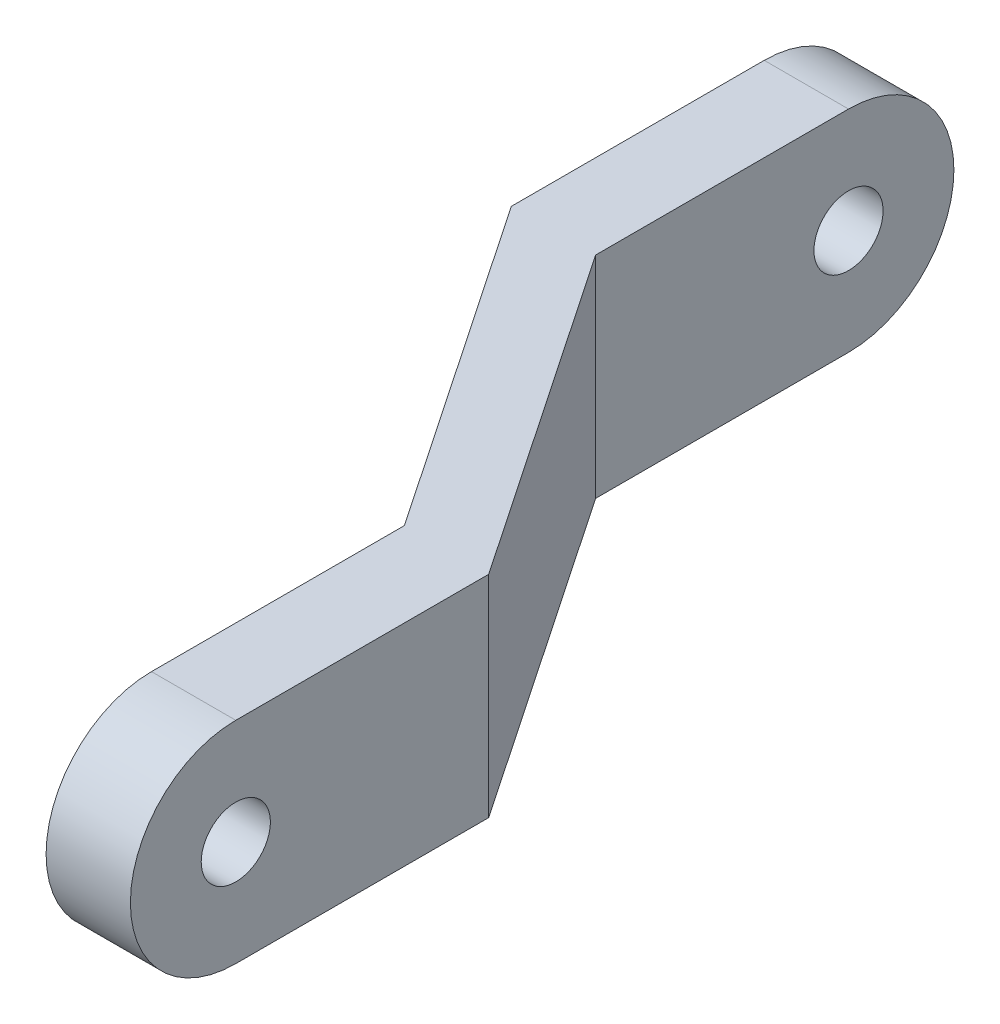
ISO-10303-21;
HEADER;
FILE_DESCRIPTION(('STEP AP214'),'2;1');
FILE_NAME('part.step','',(''),(''),'','','');
FILE_SCHEMA(('AUTOMOTIVE_DESIGN { 1 0 10303 214 1 1 1 1 }'));
ENDSEC;
DATA;
#1=APPLICATION_CONTEXT('core data for automotive mechanical design processes');
#2=APPLICATION_PROTOCOL_DEFINITION('international standard','automotive_design',2000,#1);
#3=PRODUCT_CONTEXT('',#1,'mechanical');
#4=PRODUCT('Part','Part','',(#3));
#5=PRODUCT_RELATED_PRODUCT_CATEGORY('part','',(#4));
#6=PRODUCT_DEFINITION_FORMATION('','',#4);
#7=PRODUCT_DEFINITION_CONTEXT('part definition',#1,'design');
#8=PRODUCT_DEFINITION('design','',#6,#7);
#9=PRODUCT_DEFINITION_SHAPE('','',#8);
#10=(LENGTH_UNIT() NAMED_UNIT(*) SI_UNIT(.MILLI.,.METRE.));
#11=(NAMED_UNIT(*) PLANE_ANGLE_UNIT() SI_UNIT($,.RADIAN.));
#12=(NAMED_UNIT(*) SI_UNIT($,.STERADIAN.) SOLID_ANGLE_UNIT());
#13=UNCERTAINTY_MEASURE_WITH_UNIT(LENGTH_MEASURE(1.E-05),#10,'distance_accuracy_value','');
#14=(GEOMETRIC_REPRESENTATION_CONTEXT(3) GLOBAL_UNCERTAINTY_ASSIGNED_CONTEXT((#13)) GLOBAL_UNIT_ASSIGNED_CONTEXT((#10,
#11,#12)) REPRESENTATION_CONTEXT('',''));
#15=CARTESIAN_POINT('',(0.,0.,0.));
#16=DIRECTION('',(0.,0.,1.));
#17=DIRECTION('',(1.,0.,0.));
#18=AXIS2_PLACEMENT_3D('',#15,#16,#17);
#19=CARTESIAN_POINT('',(-16.6816631341129,6.35,25.1794192887913));
#20=DIRECTION('',(-1.,0.,0.));
#21=DIRECTION('',(0.,0.,1.));
#22=AXIS2_PLACEMENT_3D('',#19,#20,#21);
#23=PLANE('',#22);
#24=CARTESIAN_POINT('',(-16.6816631341129,3.175,25.1794192887913));
#25=DIRECTION('',(-1.,0.,0.));
#26=DIRECTION('',(0.,0.,1.));
#27=AXIS2_PLACEMENT_3D('',#24,#25,#26);
#28=CIRCLE('',#27,3.175);
#29=CARTESIAN_POINT('',(-16.6816631341129,6.35,25.1794192887913));
#30=VERTEX_POINT('',#29);
#31=CARTESIAN_POINT('',(-16.6816631341129,0.,25.1794192887913));
#32=VERTEX_POINT('',#31);
#33=EDGE_CURVE('E141',#30,#32,#28,.F.);
#34=ORIENTED_EDGE('',*,*,#33,.T.);
#35=DIRECTION('',(0.,0.,-1.));
#36=VECTOR('',#35,1.);
#37=CARTESIAN_POINT('',(-16.6816631341129,0.,25.1794192887913));
#38=LINE('',#37,#36);
#39=CARTESIAN_POINT('',(-16.6816631341129,0.,17.5594192887913));
#40=VERTEX_POINT('',#39);
#41=EDGE_CURVE('E192',#32,#40,#38,.T.);
#42=ORIENTED_EDGE('',*,*,#41,.T.);
#43=DIRECTION('',(0.,-1.,0.));
#44=VECTOR('',#43,1.);
#45=CARTESIAN_POINT('',(-16.6816631341129,6.35,17.5594192887913));
#46=LINE('',#45,#44);
#47=CARTESIAN_POINT('',(-16.6816631341129,6.35,17.5594192887913));
#48=VERTEX_POINT('',#47);
#49=EDGE_CURVE('E237',#48,#40,#46,.T.);
#50=ORIENTED_EDGE('',*,*,#49,.F.);
#51=DIRECTION('',(0.,0.,-1.));
#52=VECTOR('',#51,1.);
#53=CARTESIAN_POINT('',(-16.681663134113,6.35,28.3544192887913));
#54=LINE('',#53,#52);
#55=EDGE_CURVE('E194',#30,#48,#54,.T.);
#56=ORIENTED_EDGE('',*,*,#55,.F.);
#57=EDGE_LOOP('',(#34,#42,#50,#56));
#58=FACE_BOUND('',#57,.T.);
#59=CARTESIAN_POINT('',(-16.6816631341129,3.175,25.1794192887913));
#60=DIRECTION('',(-1.,0.,0.));
#61=DIRECTION('',(0.,0.,1.));
#62=AXIS2_PLACEMENT_3D('',#59,#60,#61);
#63=CIRCLE('',#62,1.0414);
#64=CARTESIAN_POINT('',(-16.6816631341129,3.175,26.2208192887913));
#65=VERTEX_POINT('',#64);
#66=EDGE_CURVE('E204',#65,#65,#63,.T.);
#67=ORIENTED_EDGE('',*,*,#66,.T.);
#68=EDGE_LOOP('',(#67));
#69=FACE_BOUND('',#68,.T.);
#70=ADVANCED_FACE('F127',(#58,#69),#23,.F.);
#71=CARTESIAN_POINT('',(-19.2216631341129,6.35,25.1794192887913));
#72=DIRECTION('',(1.,0.,0.));
#73=DIRECTION('',(0.,0.,-1.));
#74=AXIS2_PLACEMENT_3D('',#71,#72,#73);
#75=PLANE('',#74);
#76=DIRECTION('',(0.,0.,1.));
#77=VECTOR('',#76,1.);
#78=CARTESIAN_POINT('',(-19.2216631341129,0.,25.1794192887913));
#79=LINE('',#78,#77);
#80=CARTESIAN_POINT('',(-19.2216631341129,0.,17.5594192887913));
#81=VERTEX_POINT('',#80);
#82=CARTESIAN_POINT('',(-19.2216631341129,0.,25.1794192887913));
#83=VERTEX_POINT('',#82);
#84=EDGE_CURVE('E226',#81,#83,#79,.T.);
#85=ORIENTED_EDGE('',*,*,#84,.T.);
#86=CARTESIAN_POINT('',(-19.2216631341129,3.175,25.1794192887913));
#87=DIRECTION('',(-1.,0.,0.));
#88=DIRECTION('',(0.,0.,1.));
#89=AXIS2_PLACEMENT_3D('',#86,#87,#88);
#90=CIRCLE('',#89,3.175);
#91=CARTESIAN_POINT('',(-19.2216631341129,6.35,25.1794192887913));
#92=VERTEX_POINT('',#91);
#93=EDGE_CURVE('E196',#92,#83,#90,.F.);
#94=ORIENTED_EDGE('',*,*,#93,.F.);
#95=DIRECTION('',(0.,0.,1.));
#96=VECTOR('',#95,1.);
#97=CARTESIAN_POINT('',(-19.2216631341129,6.35,25.1794192887913));
#98=LINE('',#97,#96);
#99=CARTESIAN_POINT('',(-19.2216631341129,6.35,17.5594192887913));
#100=VERTEX_POINT('',#99);
#101=EDGE_CURVE('E216',#100,#92,#98,.T.);
#102=ORIENTED_EDGE('',*,*,#101,.F.);
#103=DIRECTION('',(0.,-1.,0.));
#104=VECTOR('',#103,1.);
#105=CARTESIAN_POINT('',(-19.2216631341129,6.35,17.5594192887913));
#106=LINE('',#105,#104);
#107=EDGE_CURVE('E228',#100,#81,#106,.T.);
#108=ORIENTED_EDGE('',*,*,#107,.T.);
#109=EDGE_LOOP('',(#85,#94,#102,#108));
#110=FACE_BOUND('',#109,.T.);
#111=CARTESIAN_POINT('',(-19.2216631341129,3.175,25.1794192887913));
#112=DIRECTION('',(-1.,0.,0.));
#113=DIRECTION('',(0.,0.,1.));
#114=AXIS2_PLACEMENT_3D('',#111,#112,#113);
#115=CIRCLE('',#114,1.0414);
#116=CARTESIAN_POINT('',(-19.2216631341129,3.175,26.2208192887913));
#117=VERTEX_POINT('',#116);
#118=EDGE_CURVE('E267',#117,#117,#115,.T.);
#119=ORIENTED_EDGE('',*,*,#118,.F.);
#120=EDGE_LOOP('',(#119));
#121=FACE_BOUND('',#120,.T.);
#122=ADVANCED_FACE('F279',(#110,#121),#75,.F.);
#123=CARTESIAN_POINT('',(-23.4003642113975,6.35,-3.175));
#124=DIRECTION('',(-1.,0.,0.));
#125=DIRECTION('',(0.,0.,1.));
#126=AXIS2_PLACEMENT_3D('',#123,#124,#125);
#127=PLANE('',#126);
#128=CARTESIAN_POINT('',(-23.4003642113975,3.175,2.78221456290195E-11));
#129=DIRECTION('',(-1.,0.,0.));
#130=DIRECTION('',(0.,0.,1.));
#131=AXIS2_PLACEMENT_3D('',#128,#129,#130);
#132=CIRCLE('',#131,1.0414);
#133=CARTESIAN_POINT('',(-23.4003642113975,3.175,1.04140000002782));
#134=VERTEX_POINT('',#133);
#135=EDGE_CURVE('E259',#134,#134,#132,.T.);
#136=ORIENTED_EDGE('',*,*,#135,.T.);
#137=EDGE_LOOP('',(#136));
#138=FACE_BOUND('',#137,.T.);
#139=DIRECTION('',(0.,0.,-1.));
#140=VECTOR('',#139,1.);
#141=CARTESIAN_POINT('',(-23.4003642113975,0.,-3.175));
#142=LINE('',#141,#140);
#143=CARTESIAN_POINT('',(-23.4003642113975,0.,7.61999999999999));
#144=VERTEX_POINT('',#143);
#145=CARTESIAN_POINT('',(-23.4003642113975,0.,2.78221456290195E-11));
#146=VERTEX_POINT('',#145);
#147=EDGE_CURVE('E212',#144,#146,#142,.T.);
#148=ORIENTED_EDGE('',*,*,#147,.T.);
#149=CARTESIAN_POINT('',(-23.4003642113975,3.175,2.78221456290195E-11));
#150=DIRECTION('',(-1.,0.,0.));
#151=DIRECTION('',(0.,0.,1.));
#152=AXIS2_PLACEMENT_3D('',#149,#150,#151);
#153=CIRCLE('',#152,3.175);
#154=CARTESIAN_POINT('',(-23.4003642113975,6.35,2.78221456290195E-11));
#155=VERTEX_POINT('',#154);
#156=EDGE_CURVE('E210',#155,#146,#153,.T.);
#157=ORIENTED_EDGE('',*,*,#156,.F.);
#158=DIRECTION('',(0.,0.,-1.));
#159=VECTOR('',#158,1.);
#160=CARTESIAN_POINT('',(-23.4003642113975,6.35,0.));
#161=LINE('',#160,#159);
#162=CARTESIAN_POINT('',(-23.4003642113975,6.35,7.61999999999999));
#163=VERTEX_POINT('',#162);
#164=EDGE_CURVE('E246',#163,#155,#161,.T.);
#165=ORIENTED_EDGE('',*,*,#164,.F.);
#166=DIRECTION('',(0.,-1.,0.));
#167=VECTOR('',#166,1.);
#168=CARTESIAN_POINT('',(-23.4003642113975,6.35,7.61999999999999));
#169=LINE('',#168,#167);
#170=EDGE_CURVE('E234',#163,#144,#169,.T.);
#171=ORIENTED_EDGE('',*,*,#170,.T.);
#172=EDGE_LOOP('',(#148,#157,#165,#171));
#173=FACE_BOUND('',#172,.T.);
#174=ADVANCED_FACE('F281',(#138,#173),#127,.F.);
#175=CARTESIAN_POINT('',(-25.9403642113975,6.35,0.));
#176=DIRECTION('',(1.,0.,0.));
#177=DIRECTION('',(0.,0.,-1.));
#178=AXIS2_PLACEMENT_3D('',#175,#176,#177);
#179=PLANE('',#178);
#180=CARTESIAN_POINT('',(-25.9403642113975,3.175,2.78221456290195E-11));
#181=DIRECTION('',(-1.,0.,0.));
#182=DIRECTION('',(0.,0.,1.));
#183=AXIS2_PLACEMENT_3D('',#180,#181,#182);
#184=CIRCLE('',#183,1.0414);
#185=CARTESIAN_POINT('',(-25.9403642113975,3.175,1.04140000002782));
#186=VERTEX_POINT('',#185);
#187=EDGE_CURVE('E262',#186,#186,#184,.T.);
#188=ORIENTED_EDGE('',*,*,#187,.F.);
#189=EDGE_LOOP('',(#188));
#190=FACE_BOUND('',#189,.T.);
#191=CARTESIAN_POINT('',(-25.9403642113975,3.175,2.78221456290195E-11));
#192=DIRECTION('',(-1.,0.,0.));
#193=DIRECTION('',(0.,0.,1.));
#194=AXIS2_PLACEMENT_3D('',#191,#192,#193);
#195=CIRCLE('',#194,3.175);
#196=CARTESIAN_POINT('',(-25.9403642113975,6.35,2.78221456290195E-11));
#197=VERTEX_POINT('',#196);
#198=CARTESIAN_POINT('',(-25.9403642113975,0.,2.78221456290195E-11));
#199=VERTEX_POINT('',#198);
#200=EDGE_CURVE('E148',#197,#199,#195,.T.);
#201=ORIENTED_EDGE('',*,*,#200,.T.);
#202=DIRECTION('',(0.,0.,1.));
#203=VECTOR('',#202,1.);
#204=CARTESIAN_POINT('',(-25.9403642113975,0.,0.));
#205=LINE('',#204,#203);
#206=CARTESIAN_POINT('',(-25.9403642113975,0.,7.61999999999999));
#207=VERTEX_POINT('',#206);
#208=EDGE_CURVE('E221',#199,#207,#205,.T.);
#209=ORIENTED_EDGE('',*,*,#208,.T.);
#210=DIRECTION('',(0.,-1.,0.));
#211=VECTOR('',#210,1.);
#212=CARTESIAN_POINT('',(-25.9403642113975,6.35,7.61999999999999));
#213=LINE('',#212,#211);
#214=CARTESIAN_POINT('',(-25.9403642113975,6.35,7.61999999999999));
#215=VERTEX_POINT('',#214);
#216=EDGE_CURVE('E231',#215,#207,#213,.T.);
#217=ORIENTED_EDGE('',*,*,#216,.F.);
#218=DIRECTION('',(0.,0.,1.));
#219=VECTOR('',#218,1.);
#220=CARTESIAN_POINT('',(-25.9403642113975,6.35,0.));
#221=LINE('',#220,#219);
#222=EDGE_CURVE('E243',#197,#215,#221,.T.);
#223=ORIENTED_EDGE('',*,*,#222,.F.);
#224=EDGE_LOOP('',(#201,#209,#217,#223));
#225=FACE_BOUND('',#224,.T.);
#226=ADVANCED_FACE('F249',(#190,#225),#179,.F.);
#227=CARTESIAN_POINT('',(-23.4003642113975,6.35,7.61999999999999));
#228=DIRECTION('',(-0.828477699390954,0.,0.560022054576311));
#229=DIRECTION('',(0.560022054576311,0.,0.828477699390954));
#230=AXIS2_PLACEMENT_3D('',#227,#228,#229);
#231=PLANE('',#230);
#232=DIRECTION('',(-0.560022054576311,0.,-0.828477699390954));
#233=VECTOR('',#232,1.);
#234=CARTESIAN_POINT('',(-23.4003642113975,0.,7.61999999999999));
#235=LINE('',#234,#233);
#236=EDGE_CURVE('E209',#40,#144,#235,.T.);
#237=ORIENTED_EDGE('',*,*,#236,.T.);
#238=ORIENTED_EDGE('',*,*,#170,.F.);
#239=DIRECTION('',(-0.560022054576311,0.,-0.828477699390954));
#240=VECTOR('',#239,1.);
#241=CARTESIAN_POINT('',(-23.4003642113975,6.35,7.61999999999999));
#242=LINE('',#241,#240);
#243=EDGE_CURVE('E253',#48,#163,#242,.T.);
#244=ORIENTED_EDGE('',*,*,#243,.F.);
#245=ORIENTED_EDGE('',*,*,#49,.T.);
#246=EDGE_LOOP('',(#237,#238,#244,#245));
#247=FACE_BOUND('',#246,.T.);
#248=ADVANCED_FACE('F297',(#247),#231,.F.);
#249=CARTESIAN_POINT('',(-25.9403642113975,6.35,7.61999999999999));
#250=DIRECTION('',(0.828477699390954,0.,-0.560022054576311));
#251=DIRECTION('',(-0.560022054576311,0.,-0.828477699390954));
#252=AXIS2_PLACEMENT_3D('',#249,#250,#251);
#253=PLANE('',#252);
#254=DIRECTION('',(0.560022054576311,0.,0.828477699390954));
#255=VECTOR('',#254,1.);
#256=CARTESIAN_POINT('',(-25.9403642113975,0.,7.61999999999999));
#257=LINE('',#256,#255);
#258=EDGE_CURVE('E223',#207,#81,#257,.T.);
#259=ORIENTED_EDGE('',*,*,#258,.T.);
#260=ORIENTED_EDGE('',*,*,#107,.F.);
#261=DIRECTION('',(0.560022054576311,0.,0.828477699390954));
#262=VECTOR('',#261,1.);
#263=CARTESIAN_POINT('',(-25.9403642113975,6.35,7.61999999999999));
#264=LINE('',#263,#262);
#265=EDGE_CURVE('E251',#215,#100,#264,.T.);
#266=ORIENTED_EDGE('',*,*,#265,.F.);
#267=ORIENTED_EDGE('',*,*,#216,.T.);
#268=EDGE_LOOP('',(#259,#260,#266,#267));
#269=FACE_BOUND('',#268,.T.);
#270=ADVANCED_FACE('F294',(#269),#253,.F.);
#271=CARTESIAN_POINT('',(0.,6.35,0.));
#272=DIRECTION('',(0.,-1.,0.));
#273=DIRECTION('',(0.,0.,-1.));
#274=AXIS2_PLACEMENT_3D('',#271,#272,#273);
#275=PLANE('',#274);
#276=ORIENTED_EDGE('',*,*,#101,.T.);
#277=DIRECTION('',(-1.,0.,0.));
#278=VECTOR('',#277,1.);
#279=CARTESIAN_POINT('',(-16.6816631341129,6.35,25.1794192887913));
#280=LINE('',#279,#278);
#281=EDGE_CURVE('E195',#30,#92,#280,.T.);
#282=ORIENTED_EDGE('',*,*,#281,.F.);
#283=ORIENTED_EDGE('',*,*,#55,.T.);
#284=ORIENTED_EDGE('',*,*,#243,.T.);
#285=ORIENTED_EDGE('',*,*,#164,.T.);
#286=DIRECTION('',(-1.,0.,0.));
#287=VECTOR('',#286,1.);
#288=CARTESIAN_POINT('',(-16.6816631341129,6.35,2.78221456290195E-11));
#289=LINE('',#288,#287);
#290=EDGE_CURVE('E134',#155,#197,#289,.T.);
#291=ORIENTED_EDGE('',*,*,#290,.T.);
#292=ORIENTED_EDGE('',*,*,#222,.T.);
#293=ORIENTED_EDGE('',*,*,#265,.T.);
#294=EDGE_LOOP('',(#276,#282,#283,#284,#285,#291,#292,#293));
#295=FACE_BOUND('',#294,.T.);
#296=ADVANCED_FACE('F242',(#295),#275,.F.);
#297=CARTESIAN_POINT('',(0.,0.,0.));
#298=DIRECTION('',(0.,-1.,0.));
#299=DIRECTION('',(0.,0.,-1.));
#300=AXIS2_PLACEMENT_3D('',#297,#298,#299);
#301=PLANE('',#300);
#302=DIRECTION('',(-1.,0.,0.));
#303=VECTOR('',#302,1.);
#304=CARTESIAN_POINT('',(-16.6816631341129,0.,25.1794192887913));
#305=LINE('',#304,#303);
#306=EDGE_CURVE('E199',#32,#83,#305,.T.);
#307=ORIENTED_EDGE('',*,*,#306,.T.);
#308=ORIENTED_EDGE('',*,*,#84,.F.);
#309=ORIENTED_EDGE('',*,*,#258,.F.);
#310=ORIENTED_EDGE('',*,*,#208,.F.);
#311=DIRECTION('',(-1.,0.,0.));
#312=VECTOR('',#311,1.);
#313=CARTESIAN_POINT('',(-16.6816631341129,0.,2.78221456290195E-11));
#314=LINE('',#313,#312);
#315=EDGE_CURVE('E12',#146,#199,#314,.T.);
#316=ORIENTED_EDGE('',*,*,#315,.F.);
#317=ORIENTED_EDGE('',*,*,#147,.F.);
#318=ORIENTED_EDGE('',*,*,#236,.F.);
#319=ORIENTED_EDGE('',*,*,#41,.F.);
#320=EDGE_LOOP('',(#307,#308,#309,#310,#316,#317,#318,#319));
#321=FACE_BOUND('',#320,.T.);
#322=ADVANCED_FACE('F207',(#321),#301,.T.);
#323=CARTESIAN_POINT('',(-16.6816631341129,3.175,2.78221456290195E-11));
#324=DIRECTION('',(-1.,0.,0.));
#325=DIRECTION('',(0.,0.,1.));
#326=AXIS2_PLACEMENT_3D('',#323,#324,#325);
#327=CYLINDRICAL_SURFACE('',#326,3.175);
#328=ORIENTED_EDGE('',*,*,#156,.T.);
#329=ORIENTED_EDGE('',*,*,#315,.T.);
#330=ORIENTED_EDGE('',*,*,#200,.F.);
#331=ORIENTED_EDGE('',*,*,#290,.F.);
#332=EDGE_LOOP('',(#328,#329,#330,#331));
#333=FACE_BOUND('',#332,.T.);
#334=ADVANCED_FACE('F309',(#333),#327,.T.);
#335=CARTESIAN_POINT('',(-16.6816631341129,3.175,2.78221456290195E-11));
#336=DIRECTION('',(-1.,0.,0.));
#337=DIRECTION('',(0.,0.,1.));
#338=AXIS2_PLACEMENT_3D('',#335,#336,#337);
#339=CYLINDRICAL_SURFACE('',#338,1.0414);
#340=CARTESIAN_POINT('',(-25.9403642113975,3.175,1.04140000002782));
#341=CARTESIAN_POINT('',(-25.9139058780642,3.175,1.04140000002782));
#342=CARTESIAN_POINT('',(-25.8874475447309,3.175,1.04140000002782));
#343=CARTESIAN_POINT('',(-25.8345308780642,3.175,1.04140000002782));
#344=CARTESIAN_POINT('',(-25.8080725447309,3.175,1.04140000002782));
#345=CARTESIAN_POINT('',(-25.7551558780642,3.175,1.04140000002782));
#346=CARTESIAN_POINT('',(-25.7286975447309,3.175,1.04140000002782));
#347=CARTESIAN_POINT('',(-25.6757808780642,3.175,1.04140000002782));
#348=CARTESIAN_POINT('',(-25.6493225447309,3.175,1.04140000002782));
#349=CARTESIAN_POINT('',(-25.5964058780642,3.175,1.04140000002782));
#350=CARTESIAN_POINT('',(-25.5699475447309,3.175,1.04140000002782));
#351=CARTESIAN_POINT('',(-25.5170308780642,3.175,1.04140000002782));
#352=CARTESIAN_POINT('',(-25.4905725447309,3.175,1.04140000002782));
#353=CARTESIAN_POINT('',(-25.4376558780642,3.175,1.04140000002782));
#354=CARTESIAN_POINT('',(-25.4111975447309,3.175,1.04140000002782));
#355=CARTESIAN_POINT('',(-25.3582808780642,3.175,1.04140000002782));
#356=CARTESIAN_POINT('',(-25.3318225447309,3.175,1.04140000002782));
#357=CARTESIAN_POINT('',(-25.2789058780642,3.175,1.04140000002782));
#358=CARTESIAN_POINT('',(-25.2524475447309,3.175,1.04140000002782));
#359=CARTESIAN_POINT('',(-25.1995308780642,3.175,1.04140000002782));
#360=CARTESIAN_POINT('',(-25.1730725447309,3.175,1.04140000002782));
#361=CARTESIAN_POINT('',(-25.1201558780642,3.175,1.04140000002782));
#362=CARTESIAN_POINT('',(-25.0936975447309,3.175,1.04140000002782));
#363=CARTESIAN_POINT('',(-25.0407808780642,3.175,1.04140000002782));
#364=CARTESIAN_POINT('',(-25.0143225447309,3.175,1.04140000002782));
#365=CARTESIAN_POINT('',(-24.9614058780642,3.175,1.04140000002782));
#366=CARTESIAN_POINT('',(-24.9349475447309,3.175,1.04140000002782));
#367=CARTESIAN_POINT('',(-24.8820308780642,3.175,1.04140000002782));
#368=CARTESIAN_POINT('',(-24.8555725447309,3.175,1.04140000002782));
#369=CARTESIAN_POINT('',(-24.8026558780642,3.175,1.04140000002782));
#370=CARTESIAN_POINT('',(-24.7761975447309,3.175,1.04140000002782));
#371=CARTESIAN_POINT('',(-24.7232808780642,3.175,1.04140000002782));
#372=CARTESIAN_POINT('',(-24.6968225447309,3.175,1.04140000002782));
#373=CARTESIAN_POINT('',(-24.6439058780642,3.175,1.04140000002782));
#374=CARTESIAN_POINT('',(-24.6174475447309,3.175,1.04140000002782));
#375=CARTESIAN_POINT('',(-24.5645308780642,3.175,1.04140000002782));
#376=CARTESIAN_POINT('',(-24.5380725447309,3.175,1.04140000002782));
#377=CARTESIAN_POINT('',(-24.4851558780642,3.175,1.04140000002782));
#378=CARTESIAN_POINT('',(-24.4586975447309,3.175,1.04140000002782));
#379=CARTESIAN_POINT('',(-24.4057808780642,3.175,1.04140000002782));
#380=CARTESIAN_POINT('',(-24.3793225447309,3.175,1.04140000002782));
#381=CARTESIAN_POINT('',(-24.3264058780642,3.175,1.04140000002782));
#382=CARTESIAN_POINT('',(-24.2999475447309,3.175,1.04140000002782));
#383=CARTESIAN_POINT('',(-24.2470308780642,3.175,1.04140000002782));
#384=CARTESIAN_POINT('',(-24.2205725447309,3.175,1.04140000002782));
#385=CARTESIAN_POINT('',(-24.1676558780642,3.175,1.04140000002782));
#386=CARTESIAN_POINT('',(-24.1411975447309,3.175,1.04140000002782));
#387=CARTESIAN_POINT('',(-24.0882808780642,3.175,1.04140000002782));
#388=CARTESIAN_POINT('',(-24.0618225447309,3.175,1.04140000002782));
#389=CARTESIAN_POINT('',(-24.0089058780642,3.175,1.04140000002782));
#390=CARTESIAN_POINT('',(-23.9824475447309,3.175,1.04140000002782));
#391=CARTESIAN_POINT('',(-23.9295308780642,3.175,1.04140000002782));
#392=CARTESIAN_POINT('',(-23.9030725447309,3.175,1.04140000002782));
#393=CARTESIAN_POINT('',(-23.8501558780642,3.175,1.04140000002782));
#394=CARTESIAN_POINT('',(-23.8236975447309,3.175,1.04140000002782));
#395=CARTESIAN_POINT('',(-23.7707808780642,3.175,1.04140000002782));
#396=CARTESIAN_POINT('',(-23.7443225447309,3.175,1.04140000002782));
#397=CARTESIAN_POINT('',(-23.6914058780642,3.175,1.04140000002782));
#398=CARTESIAN_POINT('',(-23.6649475447309,3.175,1.04140000002782));
#399=CARTESIAN_POINT('',(-23.6120308780642,3.175,1.04140000002782));
#400=CARTESIAN_POINT('',(-23.5855725447309,3.175,1.04140000002782));
#401=CARTESIAN_POINT('',(-23.5326558780642,3.175,1.04140000002782));
#402=CARTESIAN_POINT('',(-23.5061975447309,3.175,1.04140000002782));
#403=CARTESIAN_POINT('',(-23.4532808780642,3.175,1.04140000002782));
#404=CARTESIAN_POINT('',(-23.4268225447309,3.175,1.04140000002782));
#405=CARTESIAN_POINT('',(-23.4003642113975,3.175,1.04140000002782));
#406=B_SPLINE_CURVE_WITH_KNOTS('',3,(#340,#341,#342,#343,#344,#345,#346,#347,#348,#349,#350,
#351,#352,#353,#354,#355,#356,#357,#358,#359,#360,#361,#362,#363,#364,#365,#366,#367,#368,#369,
#370,#371,#372,#373,#374,#375,#376,#377,#378,#379,#380,#381,#382,#383,#384,#385,#386,#387,#388,
#389,#390,#391,#392,#393,#394,#395,#396,#397,#398,#399,#400,#401,#402,#403,#404,#405),
.UNSPECIFIED.,.F.,.F.,(4,2,2,2,2,2,2,2,2,2,2,2,2,2,2,2,2,2,2,2,2,2,2,2,2,2,2,2,2,2,2,2,4),(0.,
0.0793749999999996,0.158749999999999,0.238124999999999,0.317499999999998,0.396874999999998,
0.476249999999998,0.555624999999997,0.634999999999997,0.714374999999996,0.793749999999996,
0.873124999999999,0.952499999999998,1.031875,1.11125,1.190625,1.27,1.349375,1.42875,1.508125,
1.5875,1.666875,1.74625,1.825625,1.905,1.984375,2.06375,2.143125,2.2225,2.301875,2.38125,
2.460625,2.54),.UNSPECIFIED.);
#407=EDGE_CURVE('BSEAM315',#186,#134,#406,.T.);
#408=ORIENTED_EDGE('',*,*,#187,.T.);
#409=ORIENTED_EDGE('',*,*,#135,.F.);
#410=ORIENTED_EDGE('',*,*,#407,.T.);
#411=ORIENTED_EDGE('',*,*,#407,.F.);
#412=EDGE_LOOP('',(#408,#410,#409,#411));
#413=FACE_BOUND('',#412,.T.);
#414=ADVANCED_FACE('F315',(#413),#339,.F.);
#415=CARTESIAN_POINT('',(-16.6816631341129,3.175,25.1794192887913));
#416=DIRECTION('',(-1.,0.,0.));
#417=DIRECTION('',(0.,0.,1.));
#418=AXIS2_PLACEMENT_3D('',#415,#416,#417);
#419=CYLINDRICAL_SURFACE('',#418,3.175);
#420=ORIENTED_EDGE('',*,*,#93,.T.);
#421=ORIENTED_EDGE('',*,*,#306,.F.);
#422=ORIENTED_EDGE('',*,*,#33,.F.);
#423=ORIENTED_EDGE('',*,*,#281,.T.);
#424=EDGE_LOOP('',(#420,#421,#422,#423));
#425=FACE_BOUND('',#424,.T.);
#426=ADVANCED_FACE('F200',(#425),#419,.T.);
#427=CARTESIAN_POINT('',(-16.6816631341129,3.175,25.1794192887913));
#428=DIRECTION('',(-1.,0.,0.));
#429=DIRECTION('',(0.,0.,1.));
#430=AXIS2_PLACEMENT_3D('',#427,#428,#429);
#431=CYLINDRICAL_SURFACE('',#430,1.0414);
#432=ORIENTED_EDGE('',*,*,#66,.F.);
#433=EDGE_LOOP('',(#432));
#434=FACE_BOUND('',#433,.T.);
#435=ORIENTED_EDGE('',*,*,#118,.T.);
#436=EDGE_LOOP('',(#435));
#437=FACE_BOUND('',#436,.T.);
#438=ADVANCED_FACE('F273',(#434,#437),#431,.F.);
#439=CLOSED_SHELL('',(#70,#122,#174,#226,#248,#270,#296,#322,#334,#414,#426,#438));
#440=MANIFOLD_SOLID_BREP('B2',#439);
#441=ADVANCED_BREP_SHAPE_REPRESENTATION('',(#18,#440),#14);
#442=SHAPE_DEFINITION_REPRESENTATION(#9,#441);
ENDSEC;
END-ISO-10303-21;
